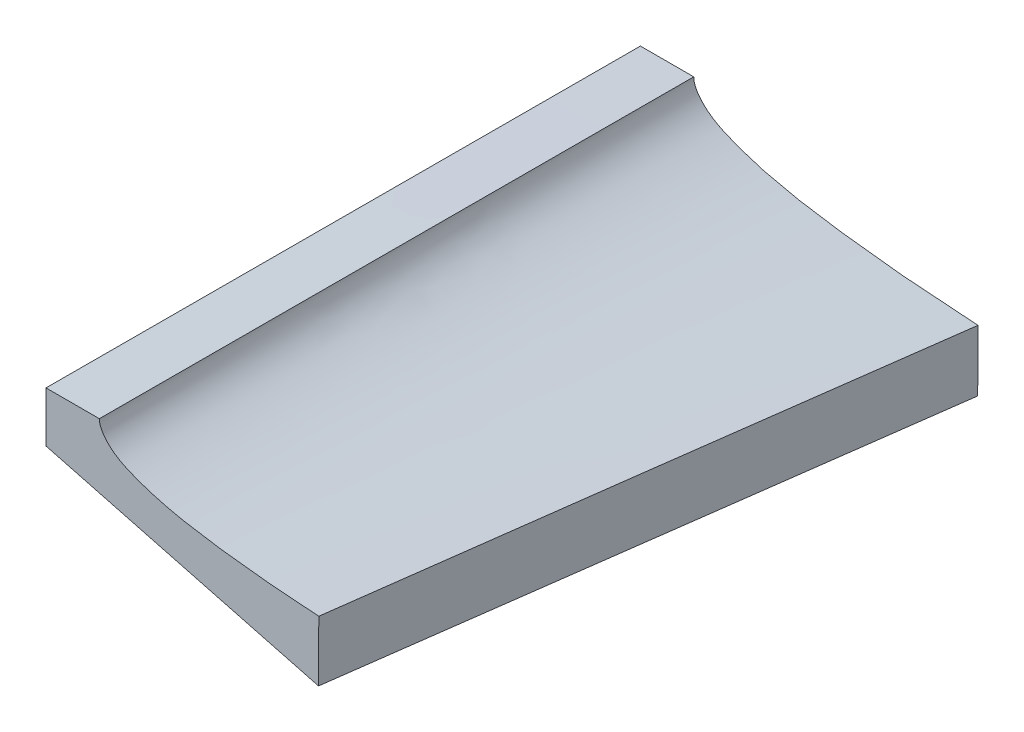
ISO-10303-21;
HEADER;
FILE_DESCRIPTION(('STEP AP214'),'2;1');
FILE_NAME('part.step','',(''),(''),'','','');
FILE_SCHEMA(('AUTOMOTIVE_DESIGN { 1 0 10303 214 1 1 1 1 }'));
ENDSEC;
DATA;
#1=APPLICATION_CONTEXT('core data for automotive mechanical design processes');
#2=APPLICATION_PROTOCOL_DEFINITION('international standard','automotive_design',2000,#1);
#3=PRODUCT_CONTEXT('',#1,'mechanical');
#4=PRODUCT('Part','Part','',(#3));
#5=PRODUCT_RELATED_PRODUCT_CATEGORY('part','',(#4));
#6=PRODUCT_DEFINITION_FORMATION('','',#4);
#7=PRODUCT_DEFINITION_CONTEXT('part definition',#1,'design');
#8=PRODUCT_DEFINITION('design','',#6,#7);
#9=PRODUCT_DEFINITION_SHAPE('','',#8);
#10=(LENGTH_UNIT() NAMED_UNIT(*) SI_UNIT(.MILLI.,.METRE.));
#11=(NAMED_UNIT(*) PLANE_ANGLE_UNIT() SI_UNIT($,.RADIAN.));
#12=(NAMED_UNIT(*) SI_UNIT($,.STERADIAN.) SOLID_ANGLE_UNIT());
#13=UNCERTAINTY_MEASURE_WITH_UNIT(LENGTH_MEASURE(1.E-05),#10,'distance_accuracy_value','');
#14=(GEOMETRIC_REPRESENTATION_CONTEXT(3) GLOBAL_UNCERTAINTY_ASSIGNED_CONTEXT((#13)) GLOBAL_UNIT_ASSIGNED_CONTEXT((#10,
#11,#12)) REPRESENTATION_CONTEXT('',''));
#15=CARTESIAN_POINT('',(0.,0.,0.));
#16=DIRECTION('',(0.,0.,1.));
#17=DIRECTION('',(1.,0.,0.));
#18=AXIS2_PLACEMENT_3D('',#15,#16,#17);
#19=CARTESIAN_POINT('',(78.7142446887617,-0.375498268026504,3.49230917465496));
#20=DIRECTION('',(-0.999005893868944,0.00476565562407811,-0.044322821904572));
#21=DIRECTION('',(-0.0443233252314437,0.,0.999017238510141));
#22=AXIS2_PLACEMENT_3D('',#19,#20,#21);
#23=PLANE('',#22);
#24=CARTESIAN_POINT('',(63.8816397999085,-23.8936946233554,335.28));
#25=CARTESIAN_POINT('',(57.6279984365695,-12.3438520220474,477.475676244309));
#26=CARTESIAN_POINT('',(51.3710550496736,-1.14711977560081,619.705423280671));
#27=CARTESIAN_POINT('',(45.1078286005831,9.31616267359365,762.));
#28=B_SPLINE_CURVE_WITH_KNOTS('',3,(#24,#25,#26,#27),.UNSPECIFIED.,.F.,.F.,(4,4),(0.,1.),.UNSPECIFIED.);
#29=CARTESIAN_POINT('',(63.8816397999085,-23.8936946233554,335.28));
#30=VERTEX_POINT('',#29);
#31=CARTESIAN_POINT('',(57.6335985297025,-12.4879144740788,477.333333673103));
#32=VERTEX_POINT('',#31);
#33=EDGE_CURVE('E109',#30,#32,#28,.T.);
#34=ORIENTED_EDGE('',*,*,#33,.F.);
#35=DIRECTION('',(-0.00477034362756242,-0.999988621846106,0.));
#36=VECTOR('',#35,1.);
#37=CARTESIAN_POINT('',(64.029302384716,7.05743866827377,335.28));
#38=LINE('',#37,#36);
#39=CARTESIAN_POINT('',(63.9474856313619,-10.0934921335993,335.280000000108));
#40=VERTEX_POINT('',#39);
#41=EDGE_CURVE('E67',#40,#30,#38,.T.);
#42=ORIENTED_EDGE('',*,*,#41,.F.);
#43=CARTESIAN_POINT('',(63.9474860704841,-10.0933967484554,335.280000000216));
#44=CARTESIAN_POINT('',(63.4940616047741,-9.26518558940558,345.588925882534));
#45=CARTESIAN_POINT('',(63.0406138034315,-8.43978066944339,355.898075962945));
#46=CARTESIAN_POINT('',(62.1336698505446,-6.79479905698389,376.516839207798));
#47=CARTESIAN_POINT('',(61.6801736989991,-5.97522236462704,386.826452372252));
#48=CARTESIAN_POINT('',(60.3196115786374,-3.52556073460117,417.7559771978));
#49=CARTESIAN_POINT('',(59.4124705991926,-1.90454178611989,438.376604768548));
#50=CARTESIAN_POINT('',(58.0516025263776,0.508228918295286,469.309058998145));
#51=CARTESIAN_POINT('',(57.5979524540632,1.30936176831684,479.62015832819));
#52=CARTESIAN_POINT('',(56.6906008677396,2.90534566628243,500.242841020626));
#53=CARTESIAN_POINT('',(56.2368993537305,3.70019671424413,510.554424383015));
#54=CARTESIAN_POINT('',(55.3294449362196,5.28368121391637,531.178080866239));
#55=CARTESIAN_POINT('',(54.8756920326461,6.07231465683907,541.490153987747));
#56=CARTESIAN_POINT('',(53.9681355941504,7.64335907854157,562.114772377922));
#57=CARTESIAN_POINT('',(53.5143320592263,8.42577005708779,572.427317646608));
#58=CARTESIAN_POINT('',(53.0605032842163,9.20506790810048,582.740097081441));
#59=B_SPLINE_CURVE_WITH_KNOTS('',3,(#43,#44,#45,#46,#47,#48,#49,#50,#51,#52,#53,#54,#55,#56,#57,
#58),.UNSPECIFIED.,.F.,.F.,(4,2,2,2,2,2,2,4),(0.,31.0562275027335,62.1124557539193,
124.224820139671,155.281177662571,186.337535098222,217.393936420478,248.450338908508),.UNSPECIFIED.);
#60=CARTESIAN_POINT('',(57.6985601110273,1.13081458393484,477.333333340028));
#61=VERTEX_POINT('',#60);
#62=EDGE_CURVE('E100',#40,#61,#59,.T.);
#63=ORIENTED_EDGE('',*,*,#62,.T.);
#64=DIRECTION('',(0.00477034362756242,0.999988621846106,0.));
#65=VECTOR('',#64,1.);
#66=CARTESIAN_POINT('',(57.6918527995392,-0.275213093781486,477.33333334));
#67=LINE('',#66,#65);
#68=EDGE_CURVE('E11',#32,#61,#67,.T.);
#69=ORIENTED_EDGE('',*,*,#68,.F.);
#70=EDGE_LOOP('',(#34,#42,#63,#69));
#71=FACE_BOUND('',#70,.T.);
#72=ADVANCED_FACE('F44',(#71),#23,.F.);
#73=CARTESIAN_POINT('',(0.,0.,477.33333334));
#74=DIRECTION('',(0.,0.,1.));
#75=DIRECTION('',(1.,0.,0.));
#76=AXIS2_PLACEMENT_3D('',#73,#74,#75);
#77=PLANE('',#76);
#78=CARTESIAN_POINT('',(57.6335985443592,-12.4879145004875,477.333333339956));
#79=CARTESIAN_POINT('',(51.343096220813,-10.8370662509772,477.333333339983));
#80=CARTESIAN_POINT('',(45.0525938972664,-9.18621800146872,477.333333339995));
#81=CARTESIAN_POINT('',(32.4715892501726,-5.88452150245357,477.333333340005));
#82=CARTESIAN_POINT('',(26.1810869266255,-4.23367325294694,477.333333340003));
#83=CARTESIAN_POINT('',(12.0363822145688,-0.521607059715049,477.333333339996));
#84=CARTESIAN_POINT('',(4.18217982605932,1.53961088401016,477.333333339992));
#85=CARTESIAN_POINT('',(-3.67202256244982,3.60082882773696,477.33333334));
#86=B_SPLINE_CURVE_WITH_KNOTS('',3,(#78,#79,#80,#81,#82,#83,#84,#85),.UNSPECIFIED.,.F.,.F.,(4,2,
2,4),(0.,19.5105477839311,39.0210955678622,63.3815970228987),.UNSPECIFIED.);
#87=CARTESIAN_POINT('',(-3.67202256245498,3.60082882773132,477.333333339912));
#88=VERTEX_POINT('',#87);
#89=EDGE_CURVE('E111',#32,#88,#86,.T.);
#90=ORIENTED_EDGE('',*,*,#89,.F.);
#91=ORIENTED_EDGE('',*,*,#68,.T.);
#92=CARTESIAN_POINT('',(8.32797743754502,14.9348879713241,477.333333339956));
#93=CARTESIAN_POINT('',(8.32795793043218,14.8218743965703,477.333333339985));
#94=CARTESIAN_POINT('',(8.33359589098671,14.7088882123699,477.333333339996));
#95=CARTESIAN_POINT('',(8.35552958562709,14.4842182803558,477.333333340004));
#96=CARTESIAN_POINT('',(8.37179992386815,14.3725320728565,477.333333340001));
#97=CARTESIAN_POINT('',(8.40356579085787,14.2072571132878,477.33333334));
#98=CARTESIAN_POINT('',(8.41527508323719,14.15291052402,477.33333334));
#99=CARTESIAN_POINT('',(8.44103625017737,14.0447762791794,477.33333334));
#100=CARTESIAN_POINT('',(8.45508807812872,13.9909886125084,477.33333334));
#101=CARTESIAN_POINT('',(8.50052422450339,13.8304814214767,477.33333334));
#102=CARTESIAN_POINT('',(8.53517804362553,13.7246743126811,477.33333334));
#103=CARTESIAN_POINT('',(8.60117652178108,13.5451224237666,477.33333334));
#104=CARTESIAN_POINT('',(8.63072672509928,13.470702500716,477.33333334));
#105=CARTESIAN_POINT('',(8.69325849422746,13.3233119706547,477.33333334));
#106=CARTESIAN_POINT('',(8.72624041902739,13.2503415162247,477.33333334));
#107=CARTESIAN_POINT('',(8.82992561448707,13.033680359475,477.33333334));
#108=CARTESIAN_POINT('',(8.90536869265241,12.8922388344394,477.33333334));
#109=CARTESIAN_POINT('',(9.06748704521697,12.6145338288482,477.33333334));
#110=CARTESIAN_POINT('',(9.15424572512345,12.4783196248817,477.33333334));
#111=CARTESIAN_POINT('',(9.33666846974343,12.2120526952535,477.33333334));
#112=CARTESIAN_POINT('',(9.43233209978419,12.0819996693166,477.33333334));
#113=CARTESIAN_POINT('',(9.70714186850122,11.7301021823823,477.33333334));
#114=CARTESIAN_POINT('',(9.89407041685518,11.5143127575544,477.33333334));
#115=CARTESIAN_POINT('',(10.2858519949957,11.0995352971013,477.33333334));
#116=CARTESIAN_POINT('',(10.4907220960244,10.9005636249789,477.33333334));
#117=CARTESIAN_POINT('',(10.9141072698621,10.5184115748054,477.33333334));
#118=CARTESIAN_POINT('',(11.1326024128082,10.3352090235633,477.33333334));
#119=CARTESIAN_POINT('',(11.5814567122469,9.9844727131404,477.33333334));
#120=CARTESIAN_POINT('',(11.8118041707091,9.81692394710414,477.33333334));
#121=CARTESIAN_POINT('',(12.3268878953137,9.46788255828424,477.33333334));
#122=CARTESIAN_POINT('',(12.6137838886443,9.28957352755272,477.33333334));
#123=CARTESIAN_POINT('',(13.0527634702125,9.03689540134583,477.33333334));
#124=CARTESIAN_POINT('',(13.200648280984,8.95507541914569,477.33333334));
#125=CARTESIAN_POINT('',(13.4988815350076,8.7960486383153,477.33333334));
#126=CARTESIAN_POINT('',(13.649229929853,8.71884174918103,477.33333334));
#127=CARTESIAN_POINT('',(13.9522676517603,8.56833238832707,477.33333334));
#128=CARTESIAN_POINT('',(14.1049613859019,8.49503884141711,477.33333334));
#129=CARTESIAN_POINT('',(14.4119364176208,8.35185530661296,477.33333334));
#130=CARTESIAN_POINT('',(14.5662177561667,8.28196540681891,477.33333334));
#131=CARTESIAN_POINT('',(14.7985734042202,8.17914268790057,477.33333334));
#132=CARTESIAN_POINT('',(14.8762017318088,8.14519501389397,477.33333334));
#133=CARTESIAN_POINT('',(15.0317106578956,8.07788226966449,477.33333334));
#134=CARTESIAN_POINT('',(15.1095912562821,8.04451719918359,477.33333334));
#135=CARTESIAN_POINT('',(15.343586026648,7.94526269244818,477.33333334));
#136=CARTESIAN_POINT('',(15.5000567614376,7.88021237802081,477.33333334));
#137=CARTESIAN_POINT('',(15.8150863942707,7.75168513424872,477.33333334));
#138=CARTESIAN_POINT('',(15.9736520195037,7.68822472116235,477.33333334));
#139=CARTESIAN_POINT('',(16.2915412319695,7.56323399646654,477.33333334));
#140=CARTESIAN_POINT('',(16.450864821521,7.50170369076591,477.33333334));
#141=CARTESIAN_POINT('',(16.9293318117369,7.31997776900205,477.33333334));
#142=CARTESIAN_POINT('',(17.2494875004767,7.20243788060354,477.33333334));
#143=CARTESIAN_POINT('',(17.8919216967104,6.97425029890027,477.33333334));
#144=CARTESIAN_POINT('',(18.2141980772742,6.8635966043228,477.33333334));
#145=CARTESIAN_POINT('',(18.8607719521214,6.6486714736197,477.33333334));
#146=CARTESIAN_POINT('',(19.1850689053129,6.54439840346415,477.33333334));
#147=CARTESIAN_POINT('',(20.1973723175573,6.22888565019356,477.33333334));
#148=CARTESIAN_POINT('',(20.8885480366629,6.02773106985594,477.33333334));
#149=CARTESIAN_POINT('',(21.9302172729851,5.74314815645663,477.33333334));
#150=CARTESIAN_POINT('',(22.2784050877212,5.65111033067005,477.33333334));
#151=CARTESIAN_POINT('',(22.9761394940321,5.47232572139104,477.33333334));
#152=CARTESIAN_POINT('',(23.3256860773434,5.38557890577463,477.33333334));
#153=CARTESIAN_POINT('',(24.0261943020988,5.21704587386033,477.33333334));
#154=CARTESIAN_POINT('',(24.3771566729314,5.13526269671436,477.33333334));
#155=CARTESIAN_POINT('',(25.0801489344086,4.97643105788103,477.33333334));
#156=CARTESIAN_POINT('',(25.4321788257585,4.89938259932263,477.33333334));
#157=CARTESIAN_POINT('',(26.4896878297542,4.67477060067625,477.33333334));
#158=CARTESIAN_POINT('',(27.1965606852831,4.53374653726466,477.33333334));
#159=CARTESIAN_POINT('',(28.6095534801829,4.26695285400133,477.33333334));
#160=CARTESIAN_POINT('',(29.3156600527835,4.14111168486132,477.33333334));
#161=CARTESIAN_POINT('',(30.7296480337374,3.90167431814887,477.33333334));
#162=CARTESIAN_POINT('',(31.4375286282739,3.78807328998459,477.33333334));
#163=CARTESIAN_POINT('',(32.8547029248096,3.57081615152437,477.33333334));
#164=CARTESIAN_POINT('',(33.5639964164451,3.46715865944877,477.33333334));
#165=CARTESIAN_POINT('',(34.6287421241488,3.31748623122989,477.33333334));
#166=CARTESIAN_POINT('',(34.9837901661949,3.26856457641141,477.33333334));
#167=CARTESIAN_POINT('',(35.6941306160367,3.17252120937306,477.33333334));
#168=CARTESIAN_POINT('',(36.0494230241858,3.12539949976232,477.33333334));
#169=CARTESIAN_POINT('',(36.7589557814524,3.03298444389455,477.33333334));
#170=CARTESIAN_POINT('',(37.1131953602549,2.98768517295281,477.33333334));
#171=CARTESIAN_POINT('',(37.8218644685066,2.89859646349137,477.33333334));
#172=CARTESIAN_POINT('',(38.1762939981874,2.85480702681756,477.33333334));
#173=CARTESIAN_POINT('',(39.2398539237473,2.72564895767331,477.33333334));
#174=CARTESIAN_POINT('',(39.9492538955536,2.64249079475341,477.33333334));
#175=CARTESIAN_POINT('',(41.3687640466414,2.48181573131773,477.33333334));
#176=CARTESIAN_POINT('',(42.0788742909319,2.40429940655946,477.33333334));
#177=CARTESIAN_POINT('',(43.499668121183,2.25473065562504,477.33333334));
#178=CARTESIAN_POINT('',(44.2103517058879,2.18267821751436,477.33333334));
#179=CARTESIAN_POINT('',(45.6322894690616,2.04386042714429,477.33333334));
#180=CARTESIAN_POINT('',(46.3435436868182,1.97709547743504,477.33333334));
#181=CARTESIAN_POINT('',(47.7665182593664,1.84872406392908,477.33333334));
#182=CARTESIAN_POINT('',(48.4782386156119,1.78711761629933,477.33333334));
#183=CARTESIAN_POINT('',(50.6140098131489,1.60969724380522,477.33333334));
#184=CARTESIAN_POINT('',(52.0386802946182,1.50128136636023,477.33333334));
#185=CARTESIAN_POINT('',(54.8925184708172,1.30194392243345,477.33333334));
#186=CARTESIAN_POINT('',(56.3216889762535,1.2110631346464,477.33333334));
#187=CARTESIAN_POINT('',(59.1808384013063,1.04441543538623,477.33333334));
#188=CARTESIAN_POINT('',(60.6108172803437,0.968647822958625,477.33333334));
#189=CARTESIAN_POINT('',(62.756235367597,0.864595164544336,477.33333334));
#190=CARTESIAN_POINT('',(63.4714469036712,0.831510848660398,477.33333334));
#191=CARTESIAN_POINT('',(64.9019993206151,0.768263807537657,477.33333334));
#192=CARTESIAN_POINT('',(65.6173402014801,0.738101082189944,477.33333334));
#193=CARTESIAN_POINT('',(67.7635119137864,0.651786544933161,477.33333334));
#194=CARTESIAN_POINT('',(69.1945118134234,0.599807411679802,477.33333334));
#195=CARTESIAN_POINT('',(72.0522307267468,0.505933798629115,477.33333334));
#196=CARTESIAN_POINT('',(73.4789487060797,0.464007421529108,477.33333334));
#197=CARTESIAN_POINT('',(76.3326050691575,0.389111957217293,477.33333334));
#198=CARTESIAN_POINT('',(77.7595434507565,0.356142787701815,477.33333334));
#199=CARTESIAN_POINT('',(80.6135941033138,0.297948626838828,477.33333334));
#200=CARTESIAN_POINT('',(82.0407063763099,0.272723737219449,477.33333334));
#201=CARTESIAN_POINT('',(84.8950547318704,0.228487143238951,477.33333334));
#202=CARTESIAN_POINT('',(86.3222908163855,0.209475567442733,477.33333334));
#203=CARTESIAN_POINT('',(88.4631948198465,0.18448994879234,477.33333334));
#204=CARTESIAN_POINT('',(89.1768430331175,0.176749989614426,477.33333334));
#205=CARTESIAN_POINT('',(90.6041492703589,0.162231051475355,477.33333334));
#206=CARTESIAN_POINT('',(91.3178072943293,0.155452072530694,477.33333334));
#207=CARTESIAN_POINT('',(93.4524185344372,0.13648613833338,477.33333334));
#208=CARTESIAN_POINT('',(94.8733834104977,0.125597928625388,477.33333334));
#209=CARTESIAN_POINT('',(97.7153201046407,0.1069999191844,477.33333334));
#210=CARTESIAN_POINT('',(99.1362919225288,0.0992900892171434,477.33333334));
#211=CARTESIAN_POINT('',(101.978205189757,0.0868494346187686,477.33333334));
#212=CARTESIAN_POINT('',(103.399146638703,0.0821185191664624,477.33333334));
#213=CARTESIAN_POINT('',(106.240961973865,0.0755160879171223,477.33333334));
#214=CARTESIAN_POINT('',(107.661835859735,0.073644422810798,477.33333334));
#215=CARTESIAN_POINT('',(110.503479304751,0.0728249817735372,477.33333334));
#216=CARTESIAN_POINT('',(111.924248863836,0.073876989479134,477.33333334));
#217=CARTESIAN_POINT('',(113.345015924122,0.0764231681496161,477.33333334));
#218=B_SPLINE_CURVE_WITH_KNOTS('',3,(#92,#93,#94,#95,#96,#97,#98,#99,#100,#101,#102,#103,#104,
#105,#106,#107,#108,#109,#110,#111,#112,#113,#114,#115,#116,#117,#118,#119,#120,#121,#122,#123,
#124,#125,#126,#127,#128,#129,#130,#131,#132,#133,#134,#135,#136,#137,#138,#139,#140,#141,#142,
#143,#144,#145,#146,#147,#148,#149,#150,#151,#152,#153,#154,#155,#156,#157,#158,#159,#160,#161,
#162,#163,#164,#165,#166,#167,#168,#169,#170,#171,#172,#173,#174,#175,#176,#177,#178,#179,#180,
#181,#182,#183,#184,#185,#186,#187,#188,#189,#190,#191,#192,#193,#194,#195,#196,#197,#198,#199,
#200,#201,#202,#203,#204,#205,#206,#207,#208,#209,#210,#211,#212,#213,#214,#215,#216,#217),
.UNSPECIFIED.,.F.,.F.,(4,2,2,2,2,2,2,2,2,2,2,2,2,2,2,2,2,2,2,2,2,2,2,2,2,2,2,2,2,2,2,2,2,2,2,2,
2,2,2,2,2,2,2,2,2,2,2,2,2,2,2,2,2,2,2,2,2,2,2,2,2,2,4),(0.,0.33887529875517,0.676944124787638,
0.843681076132186,1.01041471030186,1.3440545265388,1.58418899520481,1.8243486094707,
2.30466455181595,2.78874532243642,3.27280247624996,4.1279079968648,4.98383617197006,
5.83854045312964,6.69241675936207,7.70477178605557,8.21174272623006,8.71870371690126,
9.22677541142439,9.73486024991613,9.98903834967854,10.2432163368726,10.7515605485846,
11.2639259012591,11.7762928223302,12.7993564050645,13.8215155346196,14.8434117918333,
17.0024229128033,18.0828355109205,19.1632415487396,20.244302562619,21.325364290916,
23.4875666360859,25.6391448050246,27.7898707156924,29.9402973216146,31.0155019195599,
32.0907080760253,33.1620771957555,34.233447625286,36.3761938103135,38.5191583598812,
40.6621182285287,42.8052410897142,44.9483706672847,49.2346011568461,53.5306824153566,
57.8265643737239,59.974488613628,62.1224127734623,66.4182010303225,70.7001728604454,
74.9821053441632,79.264094072536,83.5461713975293,85.687241457014,87.8283115532523,
92.0913270975676,96.3543020891148,100.617147104727,104.879769508099,109.142076468787),.UNSPECIFIED.);
#219=CARTESIAN_POINT('',(8.32797743754502,14.9348879713241,477.333333339912));
#220=VERTEX_POINT('',#219);
#221=EDGE_CURVE('E104',#220,#61,#218,.T.);
#222=ORIENTED_EDGE('',*,*,#221,.F.);
#223=DIRECTION('',(-1.,0.,0.));
#224=VECTOR('',#223,1.);
#225=CARTESIAN_POINT('',(2.32797743755019,14.9348879713293,477.33333334));
#226=LINE('',#225,#224);
#227=CARTESIAN_POINT('',(-3.67202256245004,14.9348879713291,477.333333339996));
#228=VERTEX_POINT('',#227);
#229=EDGE_CURVE('E213',#228,#220,#226,.F.);
#230=ORIENTED_EDGE('',*,*,#229,.F.);
#231=CARTESIAN_POINT('',(-3.67202256245498,3.60082882773132,477.333333339956));
#232=CARTESIAN_POINT('',(-3.67202256245196,4.60082882773132,477.333333339982));
#233=CARTESIAN_POINT('',(-3.67202256245046,5.60082882773133,477.333333339994));
#234=CARTESIAN_POINT('',(-3.67202256244919,7.60082882773133,477.333333340005));
#235=CARTESIAN_POINT('',(-3.67202256244941,8.60082882773133,477.333333340003));
#236=CARTESIAN_POINT('',(-3.67202256245051,11.378848542264,477.333333339994));
#237=CARTESIAN_POINT('',(-3.67202256245178,13.1568682567966,477.333333339983));
#238=CARTESIAN_POINT('',(-3.67202256244981,14.9348879713293,477.33333334));
#239=B_SPLINE_CURVE_WITH_KNOTS('',3,(#231,#232,#233,#234,#235,#236,#237,#238),.UNSPECIFIED.,.F.,
.F.,(4,2,2,4),(0.,3.00000000000002,6.00000000000002,11.334059143598),.UNSPECIFIED.);
#240=EDGE_CURVE('E178',#88,#228,#239,.T.);
#241=ORIENTED_EDGE('',*,*,#240,.F.);
#242=EDGE_LOOP('',(#90,#91,#222,#230,#241));
#243=FACE_BOUND('',#242,.T.);
#244=ADVANCED_FACE('F142',(#243),#77,.T.);
#245=CARTESIAN_POINT('',(-11.9992198962899,-5.65421192699635,335.28));
#246=CARTESIAN_POINT('',(-3.66173708881561,3.742547211071,477.475676244309));
#247=CARTESIAN_POINT('',(4.67244369510174,12.786195994277,619.705423280671));
#248=CARTESIAN_POINT('',(13.0003414168245,21.0963949802308,762.));
#249=CARTESIAN_POINT('',(-5.67581492160667,-7.1741688183596,335.28));
#250=CARTESIAN_POINT('',(1.44574087163314,2.40201394164447,477.475676244309));
#251=CARTESIAN_POINT('',(8.56399464131605,11.6250863467872,619.705423280671));
#252=CARTESIAN_POINT('',(15.6759653488044,20.1147089546777,762.));
#253=CARTESIAN_POINT('',(6.97099502775974,-10.2140826010861,335.28));
#254=CARTESIAN_POINT('',(11.6606967925307,-0.279052597208583,477.475676244309));
#255=CARTESIAN_POINT('',(16.3470965337447,9.30286705180755,619.705423280672));
#256=CARTESIAN_POINT('',(21.0272132127642,18.1513369035715,762.000000000001));
#257=CARTESIAN_POINT('',(25.9412099518093,-14.7739532751759,335.28));
#258=CARTESIAN_POINT('',(26.9831306738769,-4.3006524054882,477.475676244309));
#259=CARTESIAN_POINT('',(28.0217493723876,5.81953810933808,619.705423280671));
#260=CARTESIAN_POINT('',(29.0540850087037,15.2062788269122,761.999999999999));
#261=CARTESIAN_POINT('',(44.9114248758589,-19.3338239492656,335.28));
#262=CARTESIAN_POINT('',(42.3055645552232,-8.32225221376779,477.475676244309));
#263=CARTESIAN_POINT('',(39.6964022110307,2.33620916686864,619.705423280671));
#264=CARTESIAN_POINT('',(37.0809568046435,12.2612207502529,762.));
#265=CARTESIAN_POINT('',(57.5582348252253,-22.3737377319921,335.28));
#266=CARTESIAN_POINT('',(52.5205204761208,-11.0033187526209,477.475676244309));
#267=CARTESIAN_POINT('',(47.4795041034593,0.0139898718890032,619.705423280671));
#268=CARTESIAN_POINT('',(42.4322046686032,10.2978486991467,762.));
#269=CARTESIAN_POINT('',(63.8816397999085,-23.8936946233554,335.28));
#270=CARTESIAN_POINT('',(57.6279984365695,-12.3438520220474,477.475676244309));
#271=CARTESIAN_POINT('',(51.3710550496736,-1.14711977560081,619.705423280671));
#272=CARTESIAN_POINT('',(45.1078286005831,9.31616267359365,762.));
#273=B_SPLINE_SURFACE_WITH_KNOTS('',3,3,((#245,#246,#247,#248),(#249,#250,#251,#252),(#253,#254,
#255,#256),(#257,#258,#259,#260),(#261,#262,#263,#264),(#265,#266,#267,#268),(#269,#270,#271,
#272)),.UNSPECIFIED.,.F.,.F.,.F.,(4,1,1,1,4),(4,4),(0.477200344873698,0.506031122922987,
0.534861900972276,0.563692679021565,0.592523457070854),(0.,1.),.UNSPECIFIED.);
#274=CARTESIAN_POINT('',(-11.9992198962899,-5.65421192699635,335.28));
#275=CARTESIAN_POINT('',(-3.66173708881561,3.742547211071,477.475676244309));
#276=CARTESIAN_POINT('',(4.67244369510174,12.786195994277,619.705423280671));
#277=CARTESIAN_POINT('',(13.0003414168245,21.0963949802308,762.));
#278=B_SPLINE_CURVE_WITH_KNOTS('',3,(#274,#275,#276,#277),.UNSPECIFIED.,.F.,.F.,(4,4),(0.,1.),.UNSPECIFIED.);
#279=CARTESIAN_POINT('',(-11.9992198962898,-5.65421192699635,335.28));
#280=VERTEX_POINT('',#279);
#281=EDGE_CURVE('E180',#280,#88,#278,.T.);
#282=CARTESIAN_POINT('',(-11.9992198962899,-5.65421192699635,335.28));
#283=CARTESIAN_POINT('',(-5.67581492160667,-7.1741688183596,335.28));
#284=CARTESIAN_POINT('',(6.97099502775974,-10.2140826010861,335.28));
#285=CARTESIAN_POINT('',(25.9412099518093,-14.7739532751759,335.28));
#286=CARTESIAN_POINT('',(44.9114248758589,-19.3338239492656,335.28));
#287=CARTESIAN_POINT('',(57.5582348252253,-22.3737377319921,335.28));
#288=CARTESIAN_POINT('',(63.8816397999085,-23.8936946233554,335.28));
#289=B_SPLINE_CURVE_WITH_KNOTS('',3,(#282,#283,#284,#285,#286,#287,#288),.UNSPECIFIED.,.F.,.F.,
(4,1,1,1,4),(0.477200344873698,0.506031122922987,0.534861900972276,0.563692679021565,
0.592523457070854),.UNSPECIFIED.);
#290=EDGE_CURVE('E72',#30,#280,#289,.F.);
#291=ORIENTED_EDGE('',*,*,#33,.T.);
#292=ORIENTED_EDGE('',*,*,#89,.T.);
#293=ORIENTED_EDGE('',*,*,#281,.F.);
#294=ORIENTED_EDGE('',*,*,#290,.F.);
#295=EDGE_LOOP('',(#291,#292,#293,#294));
#296=FACE_BOUND('',#295,.T.);
#297=ADVANCED_FACE('F230',(#296),#273,.T.);
#298=CARTESIAN_POINT('',(-11.9992198962898,6.34578807300365,335.28));
#299=CARTESIAN_POINT('',(-3.66173708881561,15.0758805444043,477.475676244309));
#300=CARTESIAN_POINT('',(4.67244369510173,23.4528626609437,619.705423280671));
#301=CARTESIAN_POINT('',(13.0003414168245,31.0963949802308,762.));
#302=CARTESIAN_POINT('',(-11.9992198962898,5.34578807300365,335.28));
#303=CARTESIAN_POINT('',(-3.66173708881561,14.1314360999599,477.475676244309));
#304=CARTESIAN_POINT('',(4.67244369510173,22.5639737720548,619.705423280671));
#305=CARTESIAN_POINT('',(13.0003414168245,30.2630616468975,762.));
#306=CARTESIAN_POINT('',(-11.9992198962899,3.34578807300365,335.280000000001));
#307=CARTESIAN_POINT('',(-3.66173708881561,12.242547211071,477.47567624431));
#308=CARTESIAN_POINT('',(4.67244369510175,20.786195994277,619.705423280673));
#309=CARTESIAN_POINT('',(13.0003414168245,28.5963949802309,762.000000000001));
#310=CARTESIAN_POINT('',(-11.9992198962898,0.345788073003645,335.28));
#311=CARTESIAN_POINT('',(-3.66173708881562,9.40921387773766,477.475676244308));
#312=CARTESIAN_POINT('',(4.67244369510172,18.1195293276103,619.705423280671));
#313=CARTESIAN_POINT('',(13.0003414168245,26.0963949802308,761.999999999999));
#314=CARTESIAN_POINT('',(-11.9992198962898,-2.65421192699635,335.28));
#315=CARTESIAN_POINT('',(-3.6617370888156,6.57588054440434,477.475676244309));
#316=CARTESIAN_POINT('',(4.67244369510175,15.4528626609437,619.705423280672));
#317=CARTESIAN_POINT('',(13.0003414168245,23.5963949802309,762.000000000001));
#318=CARTESIAN_POINT('',(-11.9992198962898,-4.65421192699635,335.28));
#319=CARTESIAN_POINT('',(-3.66173708881561,4.68699165551545,477.475676244309));
#320=CARTESIAN_POINT('',(4.67244369510173,13.6750848831659,619.705423280671));
#321=CARTESIAN_POINT('',(13.0003414168245,21.9297283135642,762.));
#322=CARTESIAN_POINT('',(-11.9992198962899,-5.65421192699635,335.28));
#323=CARTESIAN_POINT('',(-3.66173708881561,3.742547211071,477.475676244309));
#324=CARTESIAN_POINT('',(4.67244369510174,12.786195994277,619.705423280671));
#325=CARTESIAN_POINT('',(13.0003414168245,21.0963949802308,762.));
#326=B_SPLINE_SURFACE_WITH_KNOTS('',3,3,((#298,#299,#300,#301),(#302,#303,#304,#305),(#306,#307,
#308,#309),(#310,#311,#312,#313),(#314,#315,#316,#317),(#318,#319,#320,#321),(#322,#323,#324,
#325)),.UNSPECIFIED.,.F.,.F.,.F.,(4,1,1,1,4),(4,4),(0.453573456884564,0.459480178881847,
0.465386900879131,0.471293622876414,0.477200344873698),(0.,1.),.UNSPECIFIED.);
#327=CARTESIAN_POINT('',(-11.9992198962898,6.34578807300365,335.28));
#328=CARTESIAN_POINT('',(-3.66173708881561,15.0758805444043,477.475676244309));
#329=CARTESIAN_POINT('',(4.67244369510173,23.4528626609437,619.705423280671));
#330=CARTESIAN_POINT('',(13.0003414168245,31.0963949802308,762.));
#331=B_SPLINE_CURVE_WITH_KNOTS('',3,(#327,#328,#329,#330),.UNSPECIFIED.,.F.,.F.,(4,4),(0.,1.),.UNSPECIFIED.);
#332=CARTESIAN_POINT('',(-11.9992198962898,6.34578807300365,335.28));
#333=VERTEX_POINT('',#332);
#334=EDGE_CURVE('E172',#333,#228,#331,.T.);
#335=CARTESIAN_POINT('',(-11.9992198962898,6.34578807300365,335.28));
#336=CARTESIAN_POINT('',(-11.9992198962898,5.34578807300365,335.28));
#337=CARTESIAN_POINT('',(-11.9992198962899,3.34578807300365,335.280000000001));
#338=CARTESIAN_POINT('',(-11.9992198962898,0.345788073003645,335.28));
#339=CARTESIAN_POINT('',(-11.9992198962898,-2.65421192699635,335.28));
#340=CARTESIAN_POINT('',(-11.9992198962898,-4.65421192699635,335.28));
#341=CARTESIAN_POINT('',(-11.9992198962899,-5.65421192699635,335.28));
#342=B_SPLINE_CURVE_WITH_KNOTS('',3,(#335,#336,#337,#338,#339,#340,#341),.UNSPECIFIED.,.F.,.F.,
(4,1,1,1,4),(0.453573456884564,0.459480178881847,0.465386900879131,0.471293622876414,
0.477200344873698),.UNSPECIFIED.);
#343=EDGE_CURVE('E161',#280,#333,#342,.F.);
#344=ORIENTED_EDGE('',*,*,#281,.T.);
#345=ORIENTED_EDGE('',*,*,#240,.T.);
#346=ORIENTED_EDGE('',*,*,#334,.F.);
#347=ORIENTED_EDGE('',*,*,#343,.F.);
#348=EDGE_LOOP('',(#344,#345,#346,#347));
#349=FACE_BOUND('',#348,.T.);
#350=ADVANCED_FACE('F141',(#349),#326,.T.);
#351=CARTESIAN_POINT('',(0.129277134142256,7.36226721491504,335.28));
#352=DIRECTION('',(0.,0.,1.));
#353=DIRECTION('',(1.,0.,0.));
#354=AXIS2_PLACEMENT_3D('',#351,#352,#353);
#355=PLANE('',#354);
#356=CARTESIAN_POINT('',(230.427487748225,-11.1882541065332,335.28));
#357=CARTESIAN_POINT('',(225.530033250582,-11.2483178417883,335.28));
#358=CARTESIAN_POINT('',(215.735288230884,-11.3583741935524,335.28));
#359=CARTESIAN_POINT('',(201.041881538052,-11.516153094875,335.28));
#360=CARTESIAN_POINT('',(186.351047883826,-11.6647714739353,335.28));
#361=CARTESIAN_POINT('',(171.654339352264,-11.7999569398217,335.28));
#362=CARTESIAN_POINT('',(159.415491119839,-11.8785087797413,335.28));
#363=CARTESIAN_POINT('',(149.614918730915,-11.8972607272146,335.28));
#364=CARTESIAN_POINT('',(142.266378786515,-11.8877873621681,335.28));
#365=CARTESIAN_POINT('',(134.926364438191,-11.8532841080502,335.28));
#366=CARTESIAN_POINT('',(127.58296279067,-11.7936474401923,335.28));
#367=CARTESIAN_POINT('',(120.224260948681,-11.7087738339262,335.28));
#368=CARTESIAN_POINT('',(112.871727519312,-11.5990652777932,335.28));
#369=CARTESIAN_POINT('',(105.54683110965,-11.4649237603348,335.28));
#370=CARTESIAN_POINT('',(98.2142226812237,-11.3065128939506,335.28));
#371=CARTESIAN_POINT('',(90.8385531955628,-11.1239962910397,335.28));
#372=CARTESIAN_POINT('',(83.5109945973927,-10.9195820892499,335.28));
#373=CARTESIAN_POINT('',(76.161258307181,-10.6713749224533,335.279999999999));
#374=CARTESIAN_POINT('',(68.823520334358,-10.3582772604647,335.280000000001));
#375=CARTESIAN_POINT('',(61.4874961297617,-9.96704952103545,335.28));
#376=CARTESIAN_POINT('',(55.3754921927232,-9.56700377525097,335.28));
#377=CARTESIAN_POINT('',(50.4948354070631,-9.18860223977207,335.28));
#378=CARTESIAN_POINT('',(46.8340721018636,-8.87048478187537,335.28));
#379=CARTESIAN_POINT('',(43.178544787059,-8.51471538158181,335.28));
#380=CARTESIAN_POINT('',(39.5262824282269,-8.11747337944201,335.28));
#381=CARTESIAN_POINT('',(35.8795212792024,-7.67749989040169,335.28));
#382=CARTESIAN_POINT('',(32.2381956990188,-7.1913421032985,335.28));
#383=CARTESIAN_POINT('',(28.6037246288076,-6.65940497392041,335.28));
#384=CARTESIAN_POINT('',(24.9771416637974,-6.07142028160309,335.28));
#385=CARTESIAN_POINT('',(21.3662771429752,-5.39896763643058,335.28));
#386=CARTESIAN_POINT('',(18.3741381185066,-4.74504531641294,335.28));
#387=CARTESIAN_POINT('',(15.9999989636762,-4.14729059067089,335.28));
#388=CARTESIAN_POINT('',(14.2291044732506,-3.65817384900325,335.279999999999));
#389=CARTESIAN_POINT('',(12.4719310769408,-3.12366805857581,335.280000000001));
#390=CARTESIAN_POINT('',(10.7306194244642,-2.53865736743934,335.28));
#391=CARTESIAN_POINT('',(9.00932384773204,-1.89694770737744,335.28));
#392=CARTESIAN_POINT('',(7.31338118019438,-1.19137266314324,335.279999999999));
#393=CARTESIAN_POINT('',(5.64740187731629,-0.415937150623605,335.280000000001));
#394=CARTESIAN_POINT('',(4.06082611121817,0.515970664890197,335.279999999999));
#395=CARTESIAN_POINT('',(2.61032774645848,1.64962180547187,335.280000000001));
#396=CARTESIAN_POINT('',(1.33248024517344,2.97656775437043,335.28));
#397=CARTESIAN_POINT('',(0.49352143871596,4.26859635303585,335.28));
#398=CARTESIAN_POINT('',(0.0780075980013322,5.4294400770813,335.28));
#399=CARTESIAN_POINT('',(0.000780103710158925,6.0397000902531,335.28));
#400=CARTESIAN_POINT('',(0.00078010371015989,6.34578807300365,335.28));
#401=B_SPLINE_CURVE_WITH_KNOTS('',3,(#356,#357,#358,#359,#360,#361,#362,#363,#364,#365,#366,
#367,#368,#369,#370,#371,#372,#373,#374,#375,#376,#377,#378,#379,#380,#381,#382,#383,#384,#385,
#386,#387,#388,#389,#390,#391,#392,#393,#394,#395,#396,#397,#398,#399,#400),.UNSPECIFIED.,.F.,
.F.,(4,1,1,1,1,1,1,1,1,1,1,1,1,1,1,1,1,1,1,1,1,1,1,1,1,1,1,1,1,1,1,1,1,1,1,1,1,1,1,1,1,1,4),(0.,
0.0267162568775603,0.0534325137551206,0.0801487706326809,0.106865027510241,0.133581284387802,
0.146939412826582,0.160297541265362,0.173655669704142,0.187013798142922,0.200371926581702,
0.213730055020482,0.227088183459263,0.240446311898043,0.253804440336823,0.267162568775603,
0.280520697214383,0.293878825653163,0.307236954091943,0.320595082530724,0.327274146750114,
0.333953210969504,0.340632275188894,0.347311339408284,0.353990403627674,0.360669467847064,
0.367348532066454,0.374027596285844,0.380706660505234,0.387385724724624,0.390725256834319,
0.394064788944015,0.39740432105371,0.400743853163405,0.4040833852731,0.407422917382795,
0.41076244949249,0.414101981602185,0.41744151371188,0.420781045821575,0.42412057793127,
0.425790343986117,0.427460110040965),.UNSPECIFIED.);
#402=CARTESIAN_POINT('',(0.00078010371015989,6.34578807300365,335.28));
#403=VERTEX_POINT('',#402);
#404=EDGE_CURVE('E59',#403,#40,#401,.F.);
#405=ORIENTED_EDGE('',*,*,#404,.T.);
#406=ORIENTED_EDGE('',*,*,#41,.T.);
#407=ORIENTED_EDGE('',*,*,#290,.T.);
#408=ORIENTED_EDGE('',*,*,#343,.T.);
#409=CARTESIAN_POINT('',(0.00078010371015989,6.34578807300365,335.28));
#410=CARTESIAN_POINT('',(-0.999219896289844,6.34578807300365,335.28));
#411=CARTESIAN_POINT('',(-2.99921989628984,6.34578807300364,335.28));
#412=CARTESIAN_POINT('',(-5.99921989628984,6.34578807300366,335.28));
#413=CARTESIAN_POINT('',(-8.99921989628983,6.34578807300364,335.28));
#414=CARTESIAN_POINT('',(-10.9992198962898,6.34578807300365,335.28));
#415=CARTESIAN_POINT('',(-11.9992198962898,6.34578807300365,335.28));
#416=B_SPLINE_CURVE_WITH_KNOTS('',3,(#409,#410,#411,#412,#413,#414,#415),.UNSPECIFIED.,.F.,.F.,
(4,1,1,1,4),(0.427460110040965,0.433988446751865,0.440516783462765,0.447045120173664,
0.453573456884564),.UNSPECIFIED.);
#417=EDGE_CURVE('E116',#333,#403,#416,.F.);
#418=ORIENTED_EDGE('',*,*,#417,.T.);
#419=EDGE_LOOP('',(#405,#406,#407,#408,#418));
#420=FACE_BOUND('',#419,.T.);
#421=ADVANCED_FACE('F114',(#420),#355,.F.);
#422=CARTESIAN_POINT('',(0.00078010371015989,6.34578807300365,335.28));
#423=CARTESIAN_POINT('',(8.33826291118439,15.0758805444043,477.475676244309));
#424=CARTESIAN_POINT('',(16.6724436951017,23.4528626609437,619.705423280671));
#425=CARTESIAN_POINT('',(25.0003414168245,31.0963949802308,762.));
#426=CARTESIAN_POINT('',(-0.999219896289844,6.34578807300365,335.28));
#427=CARTESIAN_POINT('',(7.33826291118439,15.0758805444043,477.475676244309));
#428=CARTESIAN_POINT('',(15.6724436951017,23.4528626609437,619.705423280671));
#429=CARTESIAN_POINT('',(24.0003414168245,31.0963949802308,762.));
#430=CARTESIAN_POINT('',(-2.99921989628984,6.34578807300364,335.28));
#431=CARTESIAN_POINT('',(5.33826291118439,15.0758805444043,477.475676244309));
#432=CARTESIAN_POINT('',(13.6724436951017,23.4528626609436,619.705423280672));
#433=CARTESIAN_POINT('',(22.0003414168245,31.0963949802308,762.));
#434=CARTESIAN_POINT('',(-5.99921989628984,6.34578807300366,335.28));
#435=CARTESIAN_POINT('',(2.33826291118439,15.0758805444044,477.475676244309));
#436=CARTESIAN_POINT('',(10.6724436951017,23.4528626609437,619.705423280671));
#437=CARTESIAN_POINT('',(19.0003414168245,31.0963949802309,761.999999999999));
#438=CARTESIAN_POINT('',(-8.99921989628983,6.34578807300364,335.28));
#439=CARTESIAN_POINT('',(-0.661737088815603,15.0758805444043,477.475676244309));
#440=CARTESIAN_POINT('',(7.67244369510174,23.4528626609436,619.705423280671));
#441=CARTESIAN_POINT('',(16.0003414168245,31.0963949802308,762.));
#442=CARTESIAN_POINT('',(-10.9992198962898,6.34578807300365,335.28));
#443=CARTESIAN_POINT('',(-2.6617370888156,15.0758805444043,477.475676244309));
#444=CARTESIAN_POINT('',(5.67244369510174,23.4528626609437,619.705423280671));
#445=CARTESIAN_POINT('',(14.0003414168245,31.0963949802308,762.));
#446=CARTESIAN_POINT('',(-11.9992198962898,6.34578807300365,335.28));
#447=CARTESIAN_POINT('',(-3.66173708881561,15.0758805444043,477.475676244309));
#448=CARTESIAN_POINT('',(4.67244369510173,23.4528626609437,619.705423280671));
#449=CARTESIAN_POINT('',(13.0003414168245,31.0963949802308,762.));
#450=B_SPLINE_SURFACE_WITH_KNOTS('',3,3,((#422,#423,#424,#425),(#426,#427,#428,#429),(#430,#431,
#432,#433),(#434,#435,#436,#437),(#438,#439,#440,#441),(#442,#443,#444,#445),(#446,#447,#448,
#449)),.UNSPECIFIED.,.F.,.F.,.F.,(4,1,1,1,4),(4,4),(0.427460110040965,0.433988446751865,
0.440516783462765,0.447045120173664,0.453573456884564),(0.,1.),.UNSPECIFIED.);
#451=CARTESIAN_POINT('',(0.00078010371015989,6.34578807300365,335.28));
#452=CARTESIAN_POINT('',(8.33826291118439,15.0758805444043,477.475676244309));
#453=CARTESIAN_POINT('',(16.6724436951017,23.4528626609437,619.705423280671));
#454=CARTESIAN_POINT('',(25.0003414168245,31.0963949802308,762.));
#455=B_SPLINE_CURVE_WITH_KNOTS('',3,(#451,#452,#453,#454),.UNSPECIFIED.,.F.,.F.,(4,4),(0.,1.),.UNSPECIFIED.);
#456=EDGE_CURVE('E173',#403,#220,#455,.T.);
#457=ORIENTED_EDGE('',*,*,#334,.T.);
#458=ORIENTED_EDGE('',*,*,#229,.T.);
#459=ORIENTED_EDGE('',*,*,#456,.F.);
#460=ORIENTED_EDGE('',*,*,#417,.F.);
#461=EDGE_LOOP('',(#457,#458,#459,#460));
#462=FACE_BOUND('',#461,.T.);
#463=ADVANCED_FACE('F140',(#462),#450,.T.);
#464=CARTESIAN_POINT('',(230.427487748225,-11.1882541065332,335.28));
#465=CARTESIAN_POINT('',(216.646373652312,2.42070995982826,477.475676244309));
#466=CARTESIAN_POINT('',(202.861957532842,15.6765636713284,619.705423280671));
#467=CARTESIAN_POINT('',(189.071258351177,28.1989675855763,762.));
#468=CARTESIAN_POINT('',(225.530033250582,-11.2483178417883,335.28));
#469=CARTESIAN_POINT('',(212.22357822943,2.28633685198175,477.475676244309));
#470=CARTESIAN_POINT('',(198.913821184721,15.4678811908904,619.705423280671));
#471=CARTESIAN_POINT('',(185.597781077818,27.915975732547,762.));
#472=CARTESIAN_POINT('',(215.735288230884,-11.3583741935524,335.28));
#473=CARTESIAN_POINT('',(203.378092000768,2.02496690246949,477.475676244309));
#474=CARTESIAN_POINT('',(191.017593747094,15.05519764363,619.705423280672));
#475=CARTESIAN_POINT('',(178.650812431226,27.3519785875383,762.000000000001));
#476=CARTESIAN_POINT('',(201.041881538052,-11.516153094875,335.28));
#477=CARTESIAN_POINT('',(190.108585188592,1.64019725104408,477.475676244309));
#478=CARTESIAN_POINT('',(179.171986815576,14.4434372421018,619.705423280671));
#479=CARTESIAN_POINT('',(168.229105380364,26.5132274359073,762.));
#480=CARTESIAN_POINT('',(186.351047883826,-11.6647714739353,335.28));
#481=CARTESIAN_POINT('',(176.840794370395,1.26667764460509,477.475676244309));
#482=CARTESIAN_POINT('',(167.327238833408,13.8450164082841,619.705423280672));
#483=CARTESIAN_POINT('',(157.807400234226,25.689905374711,762.));
#484=CARTESIAN_POINT('',(171.654339352264,-11.7999569398217,335.28));
#485=CARTESIAN_POINT('',(163.567231405309,0.915312774966392,477.475676244309));
#486=CARTESIAN_POINT('',(155.476821434798,13.2774721348931,619.705423280671));
#487=CARTESIAN_POINT('',(147.380128402092,24.9061816975677,762.));
#488=CARTESIAN_POINT('',(159.415491119839,-11.8785087797413,335.28));
#489=CARTESIAN_POINT('',(152.51159371465,0.66220475915478,477.475676244309));
#490=CARTESIAN_POINT('',(145.604394285905,12.8498079431895,619.705423280672));
#491=CARTESIAN_POINT('',(138.690911794964,24.3039613299721,762.000000000001));
#492=CARTESIAN_POINT('',(149.614918730915,-11.8972607272146,335.28));
#493=CARTESIAN_POINT('',(143.658693667779,0.499539378032464,477.475676244309));
#494=CARTESIAN_POINT('',(137.699166581086,12.5432291284181,619.705423280671));
#495=CARTESIAN_POINT('',(131.733356432198,23.8534690815516,761.999999999999));
#496=CARTESIAN_POINT('',(142.266378786515,-11.8877873621681,335.28));
#497=CARTESIAN_POINT('',(137.020817523812,0.3984965065197,477.475676244309));
#498=CARTESIAN_POINT('',(131.771954237552,12.3316700203462,619.705423280671));
#499=CARTESIAN_POINT('',(126.516807889097,23.5313937369205,762.));
#500=CARTESIAN_POINT('',(134.926364438191,-11.8532841080502,335.28));
#501=CARTESIAN_POINT('',(130.38775757126,0.319441310298585,477.475676244309));
#502=CARTESIAN_POINT('',(125.845848680773,12.139056373786,619.705423280672));
#503=CARTESIAN_POINT('',(121.297656728091,23.2252216400213,762.));
#504=CARTESIAN_POINT('',(127.58296279067,-11.7936474401923,335.28));
#505=CARTESIAN_POINT('',(123.752433935565,0.262438665166331,477.475676244309));
#506=CARTESIAN_POINT('',(119.918603056902,11.9654144156636,619.705423280671));
#507=CARTESIAN_POINT('',(116.078489116044,22.9349403689088,762.));
#508=CARTESIAN_POINT('',(120.224260948681,-11.7087738339262,335.28));
#509=CARTESIAN_POINT('',(117.106486801954,0.227472772811988,477.475676244308));
#510=CARTESIAN_POINT('',(113.98541063167,11.8106090246888,619.705423280671));
#511=CARTESIAN_POINT('',(110.858051399191,22.6602954793134,761.999999999999));
#512=CARTESIAN_POINT('',(112.871727519312,-11.5990652777932,335.28));
#513=CARTESIAN_POINT('',(110.464465290065,0.214090293615658,477.475676244309));
#514=CARTESIAN_POINT('',(108.053901037262,11.6741355101631,619.705423280672));
#515=CARTESIAN_POINT('',(105.637053722264,22.4007309294584,762.000000000001));
#516=CARTESIAN_POINT('',(105.54683110965,-11.4649237603348,335.28));
#517=CARTESIAN_POINT('',(103.840572132673,0.222080833411012,477.475676244308));
#518=CARTESIAN_POINT('',(102.131011132139,11.5559750722955,619.705423280671));
#519=CARTESIAN_POINT('',(100.415167069411,22.1564195139279,761.999999999999));
#520=CARTESIAN_POINT('',(98.2142226812237,-11.3065128939506,335.28));
#521=CARTESIAN_POINT('',(97.211345975976,0.250800792579418,477.475676244309));
#522=CARTESIAN_POINT('',(96.2051672471714,11.455004124248,619.705423280671));
#523=CARTESIAN_POINT('',(95.1927054561723,21.9257576586645,762.));
#524=CARTESIAN_POINT('',(90.8385531955628,-11.1239962910397,335.28));
#525=CARTESIAN_POINT('',(90.5531109418545,0.302433371131044,477.475676244309));
#526=CARTESIAN_POINT('',(90.2643666645894,11.3757526784404,619.705423280672));
#527=CARTESIAN_POINT('',(89.9693393251297,21.7156221884976,762.));
#528=CARTESIAN_POINT('',(83.5109945973927,-10.9195820892499,335.28));
#529=CARTESIAN_POINT('',(83.926583969072,0.380127169203232,477.475676244308));
#530=CARTESIAN_POINT('',(84.3388713171944,11.326726072795,619.705423280671));
#531=CARTESIAN_POINT('',(84.7448756031223,21.5398751791346,761.999999999999));
#532=CARTESIAN_POINT('',(76.161258307181,-10.6713749224533,335.279999999999));
#533=CARTESIAN_POINT('',(77.2847560650143,0.501787157716093,477.475676244309));
#534=CARTESIAN_POINT('',(78.4049517992907,11.3218388830241,619.705423280672));
#535=CARTESIAN_POINT('',(79.5188644713725,21.4084408110801,762.000000000001));
#536=CARTESIAN_POINT('',(68.823520334358,-10.3582772604647,335.280000000001));
#537=CARTESIAN_POINT('',(70.6506292423042,0.683711516482073,477.475676244309));
#538=CARTESIAN_POINT('',(72.4744361266934,11.3725899385675,619.705423280671));
#539=CARTESIAN_POINT('',(74.2919599488881,21.3280185634007,761.999999999999));
#540=CARTESIAN_POINT('',(61.4874961297617,-9.96704952103545,335.28));
#541=CARTESIAN_POINT('',(64.017124121611,0.936880246173633,477.475676244309));
#542=CARTESIAN_POINT('',(66.5434500899033,11.4876996585213,619.705423280672));
#543=CARTESIAN_POINT('',(69.0634929960011,21.3050692736169,762.000000000001));
#544=CARTESIAN_POINT('',(55.3754921927232,-9.56700377525097,335.28));
#545=CARTESIAN_POINT('',(58.4904763895756,1.21813802521718,477.475676244309));
#546=CARTESIAN_POINT('',(61.6021585628712,11.6501694708239,619.705423280671));
#547=CARTESIAN_POINT('',(64.7075576739721,21.3487511191786,761.999999999999));
#548=CARTESIAN_POINT('',(50.4948354070631,-9.18860223977207,335.28));
#549=CARTESIAN_POINT('',(54.0752739187351,1.4977962848329,477.475676244309));
#550=CARTESIAN_POINT('',(57.6524104068503,11.8310844545765,619.705423280671));
#551=CARTESIAN_POINT('',(61.2232638327708,21.430922827068,762.));
#552=CARTESIAN_POINT('',(46.8340721018636,-8.87048478187537,335.28));
#553=CARTESIAN_POINT('',(50.7640623098537,1.73895869988424,477.475676244309));
#554=CARTESIAN_POINT('',(54.6907504942869,11.9952918267825,619.705423280671));
#555=CARTESIAN_POINT('',(58.6111556165256,21.5181751564286,762.));
#556=CARTESIAN_POINT('',(43.178544787059,-8.51471538158181,335.28));
#557=CARTESIAN_POINT('',(47.4566079573641,2.0142323373313,477.475676244309));
#558=CARTESIAN_POINT('',(51.7313691041122,12.190069701383,619.705423280671));
#559=CARTESIAN_POINT('',(55.9998471886658,21.6324572681826,762.));
#560=CARTESIAN_POINT('',(39.5262824282269,-8.11747337944201,335.28));
#561=CARTESIAN_POINT('',(44.1517209447584,2.32645071561731,477.475676244309));
#562=CARTESIAN_POINT('',(48.773857437733,12.4172644558152,619.705423280671));
#563=CARTESIAN_POINT('',(53.389710868513,21.7746283987611,762.));
#564=CARTESIAN_POINT('',(35.8795212792024,-7.67749989040169,335.28));
#565=CARTESIAN_POINT('',(40.8510027529554,2.67715547604741,477.475676244309));
#566=CARTESIAN_POINT('',(45.8191822031515,12.6787004876351,619.705423280671));
#567=CARTESIAN_POINT('',(50.781078591153,21.9467957019707,761.999999999999));
#568=CARTESIAN_POINT('',(32.2381956990188,-7.1913421032985,335.28));
#569=CARTESIAN_POINT('',(37.5542925748199,3.06845395553152,477.475676244309));
#570=CARTESIAN_POINT('',(42.867087427064,12.9751396595002,619.705423280672));
#571=CARTESIAN_POINT('',(48.1735992171135,22.1483755662167,762.000000000002));
#572=CARTESIAN_POINT('',(28.6037246288076,-6.65940497392041,335.28));
#573=CARTESIAN_POINT('',(34.2633670947872,3.50300644583216,477.475676244308));
#574=CARTESIAN_POINT('',(39.9197075372099,13.3123075107233,619.705423280671));
#575=CARTESIAN_POINT('',(45.5697649174381,22.3881587783624,761.999999999999));
#576=CARTESIAN_POINT('',(24.9771416637974,-6.07142028160309,335.28));
#577=CARTESIAN_POINT('',(30.9802693732751,3.99303579542072,477.475676244309));
#578=CARTESIAN_POINT('',(36.9800950591959,13.7043815175832,619.705423280672));
#579=CARTESIAN_POINT('',(42.9736376829221,22.6822774424935,762.000000000001));
#580=CARTESIAN_POINT('',(21.3662771429752,-5.39896763643058,335.28));
#581=CARTESIAN_POINT('',(27.711642820666,4.56245718017315,477.475676244308));
#582=CARTESIAN_POINT('',(34.0537064747999,14.1707716419155,619.705423280671));
#583=CARTESIAN_POINT('',(40.3894870667392,23.0456363064057,761.999999999999));
#584=CARTESIAN_POINT('',(18.3741381185066,-4.74504531641294,335.28));
#585=CARTESIAN_POINT('',(25.0011385600698,5.12495623020042,477.475676244309));
#586=CARTESIAN_POINT('',(31.624836978076,14.6418474219524,619.705423280671));
#587=CARTESIAN_POINT('',(38.2422523338877,23.4252888164523,762.));
#588=CARTESIAN_POINT('',(15.9999989636762,-4.14729059067089,335.28));
#589=CARTESIAN_POINT('',(22.8473132109946,5.64347300320318,477.475676244309));
#590=CARTESIAN_POINT('',(29.6913254347561,15.0811262422159,619.705423280672));
#591=CARTESIAN_POINT('',(36.529054596323,23.7853296839764,762.));
#592=CARTESIAN_POINT('',(14.2291044732506,-3.65817384900325,335.279999999999));
#593=CARTESIAN_POINT('',(21.2396969316339,6.06984724835331,477.475676244308));
#594=CARTESIAN_POINT('',(28.2469873664604,15.4447579908485,619.705423280671));
#595=CARTESIAN_POINT('',(35.2479947390923,24.0862189360916,762.));
#596=CARTESIAN_POINT('',(12.4719310769408,-3.12366805857581,335.280000000001));
#597=CARTESIAN_POINT('',(19.645001954822,6.53766415423258,477.475676244309));
#598=CARTESIAN_POINT('',(26.8147708091464,15.8458860121796,619.705423280672));
#599=CARTESIAN_POINT('',(33.9782566012761,24.4206580728745,762.000000000001));
#600=CARTESIAN_POINT('',(10.7306194244642,-2.53865736743934,335.28));
#601=CARTESIAN_POINT('',(18.0660425372246,7.05077159821161,477.475676244308));
#602=CARTESIAN_POINT('',(25.3981636264281,16.2870902090012,619.705423280671));
#603=CARTESIAN_POINT('',(32.7240016534371,24.7899590225387,761.999999999999));
#604=CARTESIAN_POINT('',(9.00932384773204,-1.89694770737744,335.28));
#605=CARTESIAN_POINT('',(16.5076350874517,7.61496997484802,477.475676244309));
#606=CARTESIAN_POINT('',(24.0026443036146,16.7737773022121,619.705423280672));
#607=CARTESIAN_POINT('',(31.4913704575828,25.1991348323241,762.000000000001));
#608=CARTESIAN_POINT('',(7.31338118019438,-1.19137266314324,335.279999999999));
#609=CARTESIAN_POINT('',(14.9750015465346,8.23377414098034,477.475676244308));
#610=CARTESIAN_POINT('',(22.633319889318,17.3058105902425,619.70542328067));
#611=CARTESIAN_POINT('',(30.2853551699067,25.6443972422526,761.999999999999));
#612=CARTESIAN_POINT('',(5.64740187731629,-0.415937150623605,335.280000000001));
#613=CARTESIAN_POINT('',(13.471147710733,8.92738398437606,477.47567624431));
#614=CARTESIAN_POINT('',(21.2915915205929,17.9175947645143,619.705423280673));
#615=CARTESIAN_POINT('',(29.1057522682581,26.1743557474005,762.000000000002));
#616=CARTESIAN_POINT('',(4.06082611121817,0.515970664890197,335.279999999999));
#617=CARTESIAN_POINT('',(12.0262220620431,9.77518842761222,477.475676244308));
#618=CARTESIAN_POINT('',(19.9883159893112,18.6812958354729,619.705423280671));
#619=CARTESIAN_POINT('',(27.9441268543847,26.8539534460814,761.999999999999));
#620=CARTESIAN_POINT('',(2.61032774645848,1.64962180547187,335.280000000001));
#621=CARTESIAN_POINT('',(10.6822118257922,10.822876301524,477.475676244309));
#622=CARTESIAN_POINT('',(18.7507938815691,19.6430204427147,619.705423280672));
#623=CARTESIAN_POINT('',(26.8130928751514,27.7297147866533,762.));
#624=CARTESIAN_POINT('',(1.33248024517344,2.97656775437043,335.28));
#625=CARTESIAN_POINT('',(9.50755973911278,12.049750929321,477.475676244309));
#626=CARTESIAN_POINT('',(17.6793372094952,20.7698237494101,619.705423280672));
#627=CARTESIAN_POINT('',(25.8448316176831,28.7564467722472,762.000000000001));
#628=CARTESIAN_POINT('',(0.49352143871596,4.26859635303585,335.28));
#629=CARTESIAN_POINT('',(8.76122407686935,13.2256893378054,477.475676244308));
#630=CARTESIAN_POINT('',(17.0256246914659,21.8296719677136,619.705423280671));
#631=CARTESIAN_POINT('',(25.2837422438678,29.7002048003697,761.999999999999));
#632=CARTESIAN_POINT('',(0.0780075980013322,5.4294400770813,335.28));
#633=CARTESIAN_POINT('',(8.40318742044651,14.262939680054,477.475676244309));
#634=CARTESIAN_POINT('',(16.7250652193348,22.7433289281652,619.705423280672));
#635=CARTESIAN_POINT('',(25.0406599560285,30.4902683790244,762.000000000001));
#636=CARTESIAN_POINT('',(0.000780103710158925,6.0397000902531,335.28));
#637=CARTESIAN_POINT('',(8.3382629111844,14.8042287968809,477.475676244309));
#638=CARTESIAN_POINT('',(16.6724436951017,23.2156471486474,619.705423280671));
#639=CARTESIAN_POINT('',(25.0003414168245,30.8936157031617,762.));
#640=CARTESIAN_POINT('',(0.00078010371015989,6.34578807300365,335.28));
#641=CARTESIAN_POINT('',(8.33826291118439,15.0758805444043,477.475676244309));
#642=CARTESIAN_POINT('',(16.6724436951017,23.4528626609437,619.705423280671));
#643=CARTESIAN_POINT('',(25.0003414168245,31.0963949802308,762.));
#644=B_SPLINE_SURFACE_WITH_KNOTS('',3,3,((#464,#465,#466,#467),(#468,#469,#470,#471),(#472,#473,
#474,#475),(#476,#477,#478,#479),(#480,#481,#482,#483),(#484,#485,#486,#487),(#488,#489,#490,
#491),(#492,#493,#494,#495),(#496,#497,#498,#499),(#500,#501,#502,#503),(#504,#505,#506,#507),
(#508,#509,#510,#511),(#512,#513,#514,#515),(#516,#517,#518,#519),(#520,#521,#522,#523),(#524,
#525,#526,#527),(#528,#529,#530,#531),(#532,#533,#534,#535),(#536,#537,#538,#539),(#540,#541,
#542,#543),(#544,#545,#546,#547),(#548,#549,#550,#551),(#552,#553,#554,#555),(#556,#557,#558,
#559),(#560,#561,#562,#563),(#564,#565,#566,#567),(#568,#569,#570,#571),(#572,#573,#574,#575),
(#576,#577,#578,#579),(#580,#581,#582,#583),(#584,#585,#586,#587),(#588,#589,#590,#591),(#592,
#593,#594,#595),(#596,#597,#598,#599),(#600,#601,#602,#603),(#604,#605,#606,#607),(#608,#609,
#610,#611),(#612,#613,#614,#615),(#616,#617,#618,#619),(#620,#621,#622,#623),(#624,#625,#626,
#627),(#628,#629,#630,#631),(#632,#633,#634,#635),(#636,#637,#638,#639),(#640,#641,#642,#643)),
.UNSPECIFIED.,.F.,.F.,.F.,(4,1,1,1,1,1,1,1,1,1,1,1,1,1,1,1,1,1,1,1,1,1,1,1,1,1,1,1,1,1,1,1,1,1,
1,1,1,1,1,1,1,1,4),(4,4),(0.,0.0267162568775603,0.0534325137551206,0.0801487706326809,
0.106865027510241,0.133581284387802,0.146939412826582,0.160297541265362,0.173655669704142,
0.187013798142922,0.200371926581702,0.213730055020482,0.227088183459263,0.240446311898043,
0.253804440336823,0.267162568775603,0.280520697214383,0.293878825653163,0.307236954091943,
0.320595082530724,0.327274146750114,0.333953210969504,0.340632275188894,0.347311339408284,
0.353990403627674,0.360669467847064,0.367348532066454,0.374027596285844,0.380706660505234,
0.387385724724624,0.390725256834319,0.394064788944015,0.39740432105371,0.400743853163405,
0.4040833852731,0.407422917382795,0.41076244949249,0.414101981602185,0.41744151371188,
0.420781045821575,0.42412057793127,0.425790343986117,0.427460110040965),(0.,1.),.UNSPECIFIED.);
#645=ORIENTED_EDGE('',*,*,#456,.T.);
#646=ORIENTED_EDGE('',*,*,#221,.T.);
#647=ORIENTED_EDGE('',*,*,#62,.F.);
#648=ORIENTED_EDGE('',*,*,#404,.F.);
#649=EDGE_LOOP('',(#645,#646,#647,#648));
#650=FACE_BOUND('',#649,.T.);
#651=ADVANCED_FACE('F46',(#650),#644,.T.);
#652=CLOSED_SHELL('',(#72,#244,#297,#350,#421,#463,#651));
#653=MANIFOLD_SOLID_BREP('B2',#652);
#654=ADVANCED_BREP_SHAPE_REPRESENTATION('',(#18,#653),#14);
#655=SHAPE_DEFINITION_REPRESENTATION(#9,#654);
ENDSEC;
END-ISO-10303-21;
